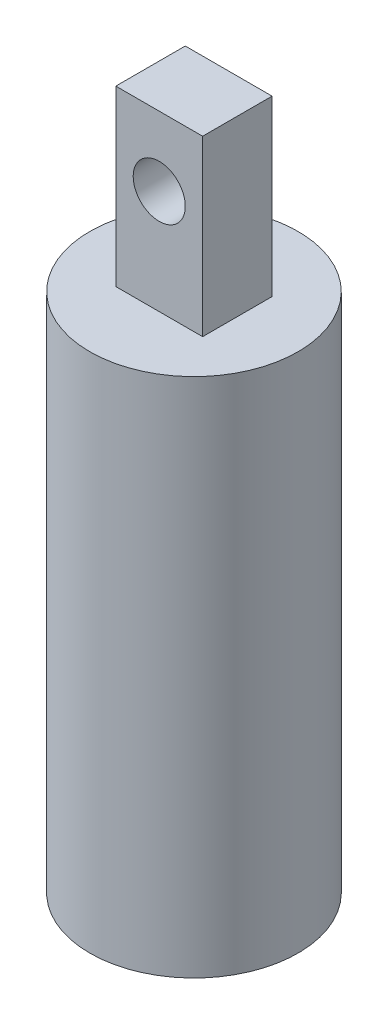
ISO-10303-21;
HEADER;
FILE_DESCRIPTION(('STEP AP214'),'2;1');
FILE_NAME('part.step','',(''),(''),'','','');
FILE_SCHEMA(('AUTOMOTIVE_DESIGN { 1 0 10303 214 1 1 1 1 }'));
ENDSEC;
DATA;
#1=APPLICATION_CONTEXT('core data for automotive mechanical design processes');
#2=APPLICATION_PROTOCOL_DEFINITION('international standard','automotive_design',2000,#1);
#3=PRODUCT_CONTEXT('',#1,'mechanical');
#4=PRODUCT('Part','Part','',(#3));
#5=PRODUCT_RELATED_PRODUCT_CATEGORY('part','',(#4));
#6=PRODUCT_DEFINITION_FORMATION('','',#4);
#7=PRODUCT_DEFINITION_CONTEXT('part definition',#1,'design');
#8=PRODUCT_DEFINITION('design','',#6,#7);
#9=PRODUCT_DEFINITION_SHAPE('','',#8);
#10=(LENGTH_UNIT() NAMED_UNIT(*) SI_UNIT(.MILLI.,.METRE.));
#11=(NAMED_UNIT(*) PLANE_ANGLE_UNIT() SI_UNIT($,.RADIAN.));
#12=(NAMED_UNIT(*) SI_UNIT($,.STERADIAN.) SOLID_ANGLE_UNIT());
#13=UNCERTAINTY_MEASURE_WITH_UNIT(LENGTH_MEASURE(1.E-05),#10,'distance_accuracy_value','');
#14=(GEOMETRIC_REPRESENTATION_CONTEXT(3) GLOBAL_UNCERTAINTY_ASSIGNED_CONTEXT((#13)) GLOBAL_UNIT_ASSIGNED_CONTEXT((#10,
#11,#12)) REPRESENTATION_CONTEXT('',''));
#15=CARTESIAN_POINT('',(0.,0.,0.));
#16=DIRECTION('',(0.,0.,1.));
#17=DIRECTION('',(1.,0.,0.));
#18=AXIS2_PLACEMENT_3D('',#15,#16,#17);
#19=CARTESIAN_POINT('',(0.,150.,0.));
#20=DIRECTION('',(0.,1.,0.));
#21=DIRECTION('',(0.,0.,1.));
#22=AXIS2_PLACEMENT_3D('',#19,#20,#21);
#23=PLANE('',#22);
#24=CARTESIAN_POINT('',(0.,150.,0.));
#25=DIRECTION('',(0.,1.,0.));
#26=DIRECTION('',(0.,0.,1.));
#27=AXIS2_PLACEMENT_3D('',#24,#25,#26);
#28=CIRCLE('',#27,30.);
#29=CARTESIAN_POINT('',(0.,150.,30.));
#30=VERTEX_POINT('',#29);
#31=EDGE_CURVE('E11',#30,#30,#28,.T.);
#32=ORIENTED_EDGE('',*,*,#31,.T.);
#33=EDGE_LOOP('',(#32));
#34=FACE_BOUND('',#33,.T.);
#35=DIRECTION('',(-1.,0.,0.));
#36=VECTOR('',#35,1.);
#37=CARTESIAN_POINT('',(-12.5,150.,-10.));
#38=LINE('',#37,#36);
#39=CARTESIAN_POINT('',(12.5,150.,-10.));
#40=VERTEX_POINT('',#39);
#41=CARTESIAN_POINT('',(-12.5,150.,-10.));
#42=VERTEX_POINT('',#41);
#43=EDGE_CURVE('E92',#40,#42,#38,.T.);
#44=ORIENTED_EDGE('',*,*,#43,.F.);
#45=DIRECTION('',(0.,0.,-1.));
#46=VECTOR('',#45,1.);
#47=CARTESIAN_POINT('',(12.5,150.,10.));
#48=LINE('',#47,#46);
#49=CARTESIAN_POINT('',(12.5,150.,10.));
#50=VERTEX_POINT('',#49);
#51=EDGE_CURVE('E103',#50,#40,#48,.T.);
#52=ORIENTED_EDGE('',*,*,#51,.F.);
#53=DIRECTION('',(1.,0.,0.));
#54=VECTOR('',#53,1.);
#55=CARTESIAN_POINT('',(-12.5,150.,10.));
#56=LINE('',#55,#54);
#57=CARTESIAN_POINT('',(-12.5,150.,10.));
#58=VERTEX_POINT('',#57);
#59=EDGE_CURVE('E73',#58,#50,#56,.T.);
#60=ORIENTED_EDGE('',*,*,#59,.F.);
#61=DIRECTION('',(0.,0.,1.));
#62=VECTOR('',#61,1.);
#63=CARTESIAN_POINT('',(-12.5,150.,10.));
#64=LINE('',#63,#62);
#65=EDGE_CURVE('E107',#42,#58,#64,.T.);
#66=ORIENTED_EDGE('',*,*,#65,.F.);
#67=EDGE_LOOP('',(#44,#52,#60,#66));
#68=FACE_BOUND('',#67,.T.);
#69=ADVANCED_FACE('F33',(#34,#68),#23,.T.);
#70=CARTESIAN_POINT('',(0.,150.,0.));
#71=DIRECTION('',(0.,-1.,0.));
#72=DIRECTION('',(0.,0.,-1.));
#73=AXIS2_PLACEMENT_3D('',#70,#71,#72);
#74=CYLINDRICAL_SURFACE('',#73,30.);
#75=CARTESIAN_POINT('',(-22.3606797749979,50.,-20.));
#76=CARTESIAN_POINT('',(-22.3606858935288,50.4882089561693,-19.9999964119226));
#77=CARTESIAN_POINT('',(-22.3767415723571,50.9764682917741,-19.9820866285813));
#78=CARTESIAN_POINT('',(-22.4401594085095,51.9483588125064,-19.9108373861768));
#79=CARTESIAN_POINT('',(-22.4875265581483,52.4319892471235,-19.8574922772833));
#80=CARTESIAN_POINT('',(-22.6113496939203,53.3911233213682,-19.7163799196857));
#81=CARTESIAN_POINT('',(-22.6878496694561,53.8666135294044,-19.6285606101057));
#82=CARTESIAN_POINT('',(-22.8665434498395,54.8053373732353,-19.4200919600602));
#83=CARTESIAN_POINT('',(-22.9687377513765,55.2685707719059,-19.2994419849513));
#84=CARTESIAN_POINT('',(-23.193728226989,56.175785139149,-19.0284426273943));
#85=CARTESIAN_POINT('',(-23.3163108203906,56.6199111296105,-18.8783985352891));
#86=CARTESIAN_POINT('',(-23.5787801839215,57.4921248793146,-18.5495380856482));
#87=CARTESIAN_POINT('',(-23.7186697909934,57.9202099941346,-18.3707170095788));
#88=CARTESIAN_POINT('',(-24.0118255935988,58.7591242148254,-17.9858478768931));
#89=CARTESIAN_POINT('',(-24.1650909347959,59.1699544203243,-17.7798015587787));
#90=CARTESIAN_POINT('',(-24.4813525241294,59.973620512308,-17.3417522052945));
#91=CARTESIAN_POINT('',(-24.644349445194,60.3664551510918,-17.1097473739498));
#92=CARTESIAN_POINT('',(-25.00257367896,61.1932268211757,-16.5827611461459));
#93=CARTESIAN_POINT('',(-25.1988679806497,61.6240409428177,-16.2835985891376));
#94=CARTESIAN_POINT('',(-25.5951544496233,62.4598274059487,-15.6533280846079));
#95=CARTESIAN_POINT('',(-25.7951468660549,62.8647979980787,-15.3222179783466));
#96=CARTESIAN_POINT('',(-26.194621993879,63.6481434866574,-14.6288076134715));
#97=CARTESIAN_POINT('',(-26.3941040691864,64.0264936382841,-14.2664790139786));
#98=CARTESIAN_POINT('',(-26.788258639696,64.7548145893199,-13.5118632099609));
#99=CARTESIAN_POINT('',(-26.9829308025026,65.1047834311923,-13.1195739425843));
#100=CARTESIAN_POINT('',(-27.3910931463656,65.8231340954399,-12.2471310095378));
#101=CARTESIAN_POINT('',(-27.6032288530363,66.1868495528045,-11.7624780965832));
#102=CARTESIAN_POINT('',(-28.0103500677694,66.8717372344808,-10.7570654072488));
#103=CARTESIAN_POINT('',(-28.2053335058183,67.1929043262227,-10.2363012863295));
#104=CARTESIAN_POINT('',(-28.5724511444835,67.7887598687195,-9.16171847148811));
#105=CARTESIAN_POINT('',(-28.7446044219641,68.0634871779264,-8.60792794262456));
#106=CARTESIAN_POINT('',(-29.0609568759301,68.5627727588207,-7.47053849984762));
#107=CARTESIAN_POINT('',(-29.205162039351,68.7873417767955,-6.88694600391359));
#108=CARTESIAN_POINT('',(-29.4464999554022,69.1602240381012,-5.76165832972235));
#109=CARTESIAN_POINT('',(-29.5470977395677,69.3142641521887,-5.22260227045828));
#110=CARTESIAN_POINT('',(-29.7196407127317,69.5772038937651,-4.1290667382128));
#111=CARTESIAN_POINT('',(-29.7915878345267,69.6861065662819,-3.57458830833751));
#112=CARTESIAN_POINT('',(-29.904587508942,69.8566974647913,-2.45588842993639));
#113=CARTESIAN_POINT('',(-29.9456724005222,69.9184351137685,-1.89167781543663));
#114=CARTESIAN_POINT('',(-29.9957633041667,69.9936647349202,-0.758659088769615));
#115=CARTESIAN_POINT('',(-30.0047738424215,70.007163514351,-0.1898516366429));
#116=CARTESIAN_POINT('',(-29.9915473981852,69.9873184370662,0.859806415927921));
#117=CARTESIAN_POINT('',(-29.9738593639155,69.9607940358833,1.34086232409545));
#118=CARTESIAN_POINT('',(-29.9156709892741,69.873310019839,2.29838953519059));
#119=CARTESIAN_POINT('',(-29.8751735935912,69.8123548499873,2.7748614218412));
#120=CARTESIAN_POINT('',(-29.7722764488344,69.6568520909165,3.71988287537239));
#121=CARTESIAN_POINT('',(-29.7098757494512,69.5623030441721,4.18843209759108));
#122=CARTESIAN_POINT('',(-29.5645234505635,69.3408382238798,5.11455664152082));
#123=CARTESIAN_POINT('',(-29.4815709628999,69.2139210515152,5.57213148802943));
#124=CARTESIAN_POINT('',(-29.2971987002846,68.9298040334638,6.47179810816158));
#125=CARTESIAN_POINT('',(-29.1958554904912,68.7727295883957,6.91394533614487));
#126=CARTESIAN_POINT('',(-28.9764235265008,68.4296096664266,7.78251525709052));
#127=CARTESIAN_POINT('',(-28.858335068488,68.2435647019401,8.20893822800988));
#128=CARTESIAN_POINT('',(-28.6075257726395,67.8441778455769,9.04431763466508));
#129=CARTESIAN_POINT('',(-28.4748045606182,67.6308352556287,9.45327362336783));
#130=CARTESIAN_POINT('',(-28.1969539999433,67.1784769804029,10.2523545489442));
#131=CARTESIAN_POINT('',(-28.0518231942476,66.9394582795807,10.6424772661187));
#132=CARTESIAN_POINT('',(-27.7317267401802,66.4042840153249,11.4527356062426));
#133=CARTESIAN_POINT('',(-27.5553463717531,66.1047473885238,11.8700812163928));
#134=CARTESIAN_POINT('',(-27.1930871485775,65.4767499308217,12.6780149842778));
#135=CARTESIAN_POINT('',(-27.007207587744,65.1482869484778,13.0686011478891));
#136=CARTESIAN_POINT('',(-26.6292105400492,64.4636253470291,13.8225619123957));
#137=CARTESIAN_POINT('',(-26.4370844912714,64.107387635318,14.185896693865));
#138=CARTESIAN_POINT('',(-26.0505351068054,63.3689696755022,14.883843396687));
#139=CARTESIAN_POINT('',(-25.8561116568934,62.9867881329827,15.2184538830105));
#140=CARTESIAN_POINT('',(-25.4387487342262,62.1362208652914,15.9077512722913));
#141=CARTESIAN_POINT('',(-25.2160728404677,61.6636681752519,16.2574779985587));
#142=CARTESIAN_POINT('',(-24.7793365815512,60.6867448691347,16.9156894234147));
#143=CARTESIAN_POINT('',(-24.5652781624035,60.1823671315698,17.2241648426867));
#144=CARTESIAN_POINT('',(-24.1532936665152,59.1437613448906,17.7972680129957));
#145=CARTESIAN_POINT('',(-23.9553464914574,58.6095739308747,18.0619535936899));
#146=CARTESIAN_POINT('',(-23.6764424287916,57.7871923826137,18.4241508744694));
#147=CARTESIAN_POINT('',(-23.586488758667,57.50958963684,18.539064186288));
#148=CARTESIAN_POINT('',(-23.4135888725702,56.9474950398416,18.7569503816948));
#149=CARTESIAN_POINT('',(-23.3306443694362,56.66300152644,18.8599203489511));
#150=CARTESIAN_POINT('',(-23.1390114191645,55.9640709186898,19.0949737019528));
#151=CARTESIAN_POINT('',(-23.0345499403737,55.5462614054596,19.2205883140043));
#152=CARTESIAN_POINT('',(-22.8454014192454,54.6992223190834,19.4450303060951));
#153=CARTESIAN_POINT('',(-22.7607089831938,54.2699958965713,19.5438649938583));
#154=CARTESIAN_POINT('',(-22.6140815263718,53.4027881110077,19.7133430846625));
#155=CARTESIAN_POINT('',(-22.5521140132966,52.9648201995233,19.78402675084));
#156=CARTESIAN_POINT('',(-22.4531500088269,52.0823363890967,19.8962732778957));
#157=CARTESIAN_POINT('',(-22.4161536183507,51.6378204636987,19.9378360210846));
#158=CARTESIAN_POINT('',(-22.3685666502113,50.7436020031146,19.9912114344644));
#159=CARTESIAN_POINT('',(-22.358093238586,50.2938852401166,20.0028921020166));
#160=CARTESIAN_POINT('',(-22.3643493087133,49.3948797020009,19.9958970388908));
#161=CARTESIAN_POINT('',(-22.381078855691,48.945590927912,19.9772212354264));
#162=CARTESIAN_POINT('',(-22.4410353821841,48.0507571397663,19.9098452800438));
#163=CARTESIAN_POINT('',(-22.4842812448844,47.6052150232529,19.8611237313693));
#164=CARTESIAN_POINT('',(-22.5954993646352,46.7214596956684,19.7344995148557));
#165=CARTESIAN_POINT('',(-22.6634720350192,46.2832466072377,19.6565963592159));
#166=CARTESIAN_POINT('',(-22.8176625120601,45.4382251784002,19.4773587360434));
#167=CARTESIAN_POINT('',(-22.9028156744356,45.0309336338161,19.3773687153742));
#168=CARTESIAN_POINT('',(-23.0905696500378,44.2270230951357,19.1532490632813));
#169=CARTESIAN_POINT('',(-23.193177203668,43.8304082928952,19.0291101035355));
#170=CARTESIAN_POINT('',(-23.4130553221982,43.0493436054479,18.7579126655137));
#171=CARTESIAN_POINT('',(-23.5303248016758,42.6648928223761,18.6108558836455));
#172=CARTESIAN_POINT('',(-23.7768089487605,41.9089960769436,18.2949037795793));
#173=CARTESIAN_POINT('',(-23.9060253493674,41.5375520121234,18.1260052876392));
#174=CARTESIAN_POINT('',(-24.2005356466709,40.7354679883655,17.731501269301));
#175=CARTESIAN_POINT('',(-24.3678787987211,40.3078327916935,17.5013086005028));
#176=CARTESIAN_POINT('',(-24.7117489529602,39.4731202414906,17.0123139239897));
#177=CARTESIAN_POINT('',(-24.8882768146534,39.0660448189915,16.7535092362064));
#178=CARTESIAN_POINT('',(-25.246838016415,38.2727606127612,16.2081390990385));
#179=CARTESIAN_POINT('',(-25.4288771074695,37.8865748863791,15.9215439116551));
#180=CARTESIAN_POINT('',(-25.7947122322757,37.1363134943561,15.3217576930429));
#181=CARTESIAN_POINT('',(-25.9785083830645,36.7722393136031,15.0085648790455));
#182=CARTESIAN_POINT('',(-26.3845748584298,35.9899770755621,14.2850209466699));
#183=CARTESIAN_POINT('',(-26.6064699077529,35.5773645182191,13.868399953091));
#184=CARTESIAN_POINT('',(-27.0422910024591,34.7883724206063,12.9981303927617));
#185=CARTESIAN_POINT('',(-27.2562155770218,34.4119995476734,12.5444750407322));
#186=CARTESIAN_POINT('',(-27.6705120036506,33.6984190377957,11.6020484650165));
#187=CARTESIAN_POINT('',(-27.8708931512095,33.3611844220412,11.1133018111967));
#188=CARTESIAN_POINT('',(-28.2529916116302,32.7287810619452,10.1024838029969));
#189=CARTESIAN_POINT('',(-28.4347139253593,32.4336010380343,9.58042143890719));
#190=CARTESIAN_POINT('',(-28.7418292040784,31.9411440611816,8.60898698059622));
#191=CARTESIAN_POINT('',(-28.871337394815,31.7359523812412,8.16491313347029));
#192=CARTESIAN_POINT('',(-29.1123779309699,31.3572563334412,7.25872966066569));
#193=CARTESIAN_POINT('',(-29.2239123246767,31.1837483546161,6.79662209756988));
#194=CARTESIAN_POINT('',(-29.4266077341683,30.8704547354404,5.85709265439536));
#195=CARTESIAN_POINT('',(-29.5177824027246,30.7306464917813,5.37968128385408));
#196=CARTESIAN_POINT('',(-29.6778186712604,30.4863780355943,4.41219358714593));
#197=CARTESIAN_POINT('',(-29.746679947541,30.3819183358641,3.92211707735813));
#198=CARTESIAN_POINT('',(-29.8607111976658,30.2094394737634,2.93054121015948));
#199=CARTESIAN_POINT('',(-29.9057729947659,30.1415866727295,2.42900032455905));
#200=CARTESIAN_POINT('',(-29.9706058238814,30.0440849964539,1.4205788168521));
#201=CARTESIAN_POINT('',(-29.990376815857,30.014436181696,0.913698186293067));
#202=CARTESIAN_POINT('',(-30.0041212399487,29.9938172077452,-0.101169392531006));
#203=CARTESIAN_POINT('',(-29.9980962089087,30.0028447443401,-0.60915627308706));
#204=CARTESIAN_POINT('',(-29.9604056252688,30.0594294541235,-1.62199988532036));
#205=CARTESIAN_POINT('',(-29.9287412395721,30.1069848738236,-2.12685675839743));
#206=CARTESIAN_POINT('',(-29.8437985658208,30.2350205740653,-3.092799752476));
#207=CARTESIAN_POINT('',(-29.7922629250282,30.312849853963,-3.55439520403418));
#208=CARTESIAN_POINT('',(-29.6689450523963,30.4999678776683,-4.46836902451353));
#209=CARTESIAN_POINT('',(-29.597163997457,30.6092547927981,-4.92074792756964));
#210=CARTESIAN_POINT('',(-29.4347944617128,30.8580043298309,-5.81367709229972));
#211=CARTESIAN_POINT('',(-29.344204797736,30.9974688501055,-6.25422660786598));
#212=CARTESIAN_POINT('',(-29.1459419809342,31.3050873348324,-7.12122590088718));
#213=CARTESIAN_POINT('',(-29.0382679265784,31.4732428133207,-7.5476749328341));
#214=CARTESIAN_POINT('',(-28.8010951909527,31.8471716831602,-8.40878779714672));
#215=CARTESIAN_POINT('',(-28.670694888708,32.0545573753971,-8.84250227551095));
#216=CARTESIAN_POINT('',(-28.3953682076704,32.4977973245283,-9.69029143409235));
#217=CARTESIAN_POINT('',(-28.2504414177065,32.7336523872842,-10.104365557902));
#218=CARTESIAN_POINT('',(-27.9485407408145,33.2321648601204,-10.9116855558948));
#219=CARTESIAN_POINT('',(-27.7915617237644,33.4948336995445,-11.3049224388242));
#220=CARTESIAN_POINT('',(-27.4682178656632,34.0452950703896,-12.0693531593151));
#221=CARTESIAN_POINT('',(-27.3018519735229,34.3330904173175,-12.4405445187535));
#222=CARTESIAN_POINT('',(-26.9357159197241,34.9795295007825,-13.2166207315211));
#223=CARTESIAN_POINT('',(-26.7348072575091,35.3421971516316,-13.6176230440809));
#224=CARTESIAN_POINT('',(-26.328297657734,36.0974614069631,-14.3878567191195));
#225=CARTESIAN_POINT('',(-26.1226961112019,36.4900619113291,-14.757083928306));
#226=CARTESIAN_POINT('',(-25.7111873767681,37.3039945349308,-15.4629181005339));
#227=CARTESIAN_POINT('',(-25.5052800753153,37.7253474084331,-15.7995010665117));
#228=CARTESIAN_POINT('',(-25.0981854077811,38.5953215433632,-16.4385088149113));
#229=CARTESIAN_POINT('',(-24.8969975860908,39.0439401574721,-16.7409369054171));
#230=CARTESIAN_POINT('',(-24.519622725546,39.932183263697,-17.288437587054));
#231=CARTESIAN_POINT('',(-24.3426994009277,40.3698820714834,-17.5361258011449));
#232=CARTESIAN_POINT('',(-24.0019984692107,41.2668444693518,-17.9996334824726));
#233=CARTESIAN_POINT('',(-23.838221257784,41.7261087078516,-18.2154519906584));
#234=CARTESIAN_POINT('',(-23.5290813254498,42.6642354776082,-18.6130511835398));
#235=CARTESIAN_POINT('',(-23.3836894022856,43.1430652893643,-18.7948860714089));
#236=CARTESIAN_POINT('',(-23.1163199010043,44.1191615403472,-19.1227764985234));
#237=CARTESIAN_POINT('',(-22.9943359489798,44.6164229165956,-19.268841780706));
#238=CARTESIAN_POINT('',(-22.802875861737,45.5146088087513,-19.4947592055363));
#239=CARTESIAN_POINT('',(-22.7277543004783,45.9124553216998,-19.5821115045836));
#240=CARTESIAN_POINT('',(-22.5970955375622,46.7158411532973,-19.7327455746581));
#241=CARTESIAN_POINT('',(-22.541555336465,47.1213792837199,-19.7960310323203));
#242=CARTESIAN_POINT('',(-22.4519236803042,47.9376537872121,-19.8976315087765));
#243=CARTESIAN_POINT('',(-22.4178171262643,48.3483862925499,-19.9359641063474));
#244=CARTESIAN_POINT('',(-22.3721912092578,49.1727335802446,-19.9871514199304));
#245=CARTESIAN_POINT('',(-22.3606745908688,49.5863487067014,-20.0000030401181));
#246=CARTESIAN_POINT('',(-22.3606797749979,50.,-20.));
#247=B_SPLINE_CURVE_WITH_KNOTS('',3,(#75,#76,#77,#78,#79,#80,#81,#82,#83,#84,#85,#86,#87,#88,
#89,#90,#91,#92,#93,#94,#95,#96,#97,#98,#99,#100,#101,#102,#103,#104,#105,#106,#107,#108,#109,
#110,#111,#112,#113,#114,#115,#116,#117,#118,#119,#120,#121,#122,#123,#124,#125,#126,#127,#128,
#129,#130,#131,#132,#133,#134,#135,#136,#137,#138,#139,#140,#141,#142,#143,#144,#145,#146,#147,
#148,#149,#150,#151,#152,#153,#154,#155,#156,#157,#158,#159,#160,#161,#162,#163,#164,#165,#166,
#167,#168,#169,#170,#171,#172,#173,#174,#175,#176,#177,#178,#179,#180,#181,#182,#183,#184,#185,
#186,#187,#188,#189,#190,#191,#192,#193,#194,#195,#196,#197,#198,#199,#200,#201,#202,#203,#204,
#205,#206,#207,#208,#209,#210,#211,#212,#213,#214,#215,#216,#217,#218,#219,#220,#221,#222,#223,
#224,#225,#226,#227,#228,#229,#230,#231,#232,#233,#234,#235,#236,#237,#238,#239,#240,#241,#242,
#243,#244,#245,#246),.UNSPECIFIED.,.T.,.F.,(4,2,2,2,2,2,2,2,2,2,2,2,2,2,2,2,2,2,2,2,2,2,2,2,2,2,
2,2,2,2,2,2,2,2,2,2,2,2,2,2,2,2,2,2,2,2,2,2,2,2,2,2,2,2,2,2,2,2,2,2,2,2,2,2,2,2,2,2,2,2,2,2,2,2,
2,2,2,2,2,2,2,2,2,2,2,4),(0.,1.46413383476119,2.92850116798433,4.3950884612604,5.86170410688106,
7.31382579475252,8.76618582863998,10.2184531650401,11.6708210407287,13.3493094048912,
15.0279112663608,16.7080533902126,18.3883112996803,20.3117642438544,22.2354490015051,
24.1575160629544,26.0791709305319,27.7853619359246,29.4914378208096,31.1957234922768,
32.8997686529781,34.3443503382155,35.7887455706705,37.2332034782288,38.6777238198782,
40.1163627603301,41.5549762578204,42.9936265517613,44.4324459938663,46.0602839475324,
47.6882430766068,49.3185364037738,50.9489111309836,52.8326361759336,54.7167842470655,
56.5984238649026,57.5389749114895,58.4797551409554,59.8242529017226,61.1683834046849,
62.5105844944298,63.8527910085193,65.2009164973756,66.5490452186684,67.8981351058559,
69.2472475454816,70.529851328563,71.8129515469024,73.095956833522,74.3791485235474,
75.9187799981372,77.4585558113538,78.999997879572,80.5415433482355,82.4201756779315,
84.2991529785491,86.1768272700558,88.0539969938139,89.5706110260008,91.0870521029024,
92.6024732144331,94.1179163090845,95.6401895843998,97.1624652697503,98.6846502640925,
100.206765984357,101.617993966733,103.029139928946,104.440374687427,105.851683940514,
107.344548709883,108.837455746597,110.331001811733,111.824715448892,113.553354854051,
115.282219865862,117.012346298594,118.742305015278,120.340261559248,121.93826618052,
123.53369984988,125.128698469926,126.370149556428,127.611410396842,128.85179584545,
130.092331986087),.UNSPECIFIED.);
#248=CARTESIAN_POINT('',(-22.3606797749979,50.,-20.));
#249=VERTEX_POINT('',#248);
#250=EDGE_CURVE('E115',#249,#249,#247,.T.);
#251=ORIENTED_EDGE('',*,*,#250,.T.);
#252=EDGE_LOOP('',(#251));
#253=FACE_BOUND('',#252,.T.);
#254=ORIENTED_EDGE('',*,*,#31,.F.);
#255=EDGE_LOOP('',(#254));
#256=FACE_BOUND('',#255,.T.);
#257=CARTESIAN_POINT('',(0.,0.,0.));
#258=DIRECTION('',(0.,1.,0.));
#259=DIRECTION('',(0.,0.,1.));
#260=AXIS2_PLACEMENT_3D('',#257,#258,#259);
#261=CIRCLE('',#260,30.);
#262=CARTESIAN_POINT('',(0.,0.,30.));
#263=VERTEX_POINT('',#262);
#264=EDGE_CURVE('E43',#263,#263,#261,.T.);
#265=ORIENTED_EDGE('',*,*,#264,.T.);
#266=EDGE_LOOP('',(#265));
#267=FACE_BOUND('',#266,.T.);
#268=ADVANCED_FACE('F35',(#253,#256,#267),#74,.T.);
#269=CARTESIAN_POINT('',(0.,0.,0.));
#270=DIRECTION('',(0.,1.,0.));
#271=DIRECTION('',(0.,0.,1.));
#272=AXIS2_PLACEMENT_3D('',#269,#270,#271);
#273=PLANE('',#272);
#274=ORIENTED_EDGE('',*,*,#264,.F.);
#275=EDGE_LOOP('',(#274));
#276=FACE_BOUND('',#275,.T.);
#277=ADVANCED_FACE('F128',(#276),#273,.F.);
#278=CARTESIAN_POINT('',(-100.,50.,0.));
#279=DIRECTION('',(1.,0.,0.));
#280=DIRECTION('',(0.,0.,-1.));
#281=AXIS2_PLACEMENT_3D('',#278,#279,#280);
#282=CYLINDRICAL_SURFACE('',#281,20.);
#283=CARTESIAN_POINT('',(0.,50.,0.));
#284=DIRECTION('',(1.,0.,0.));
#285=DIRECTION('',(0.,0.,-1.));
#286=AXIS2_PLACEMENT_3D('',#283,#284,#285);
#287=CIRCLE('',#286,20.);
#288=CARTESIAN_POINT('',(0.,50.,-20.));
#289=VERTEX_POINT('',#288);
#290=EDGE_CURVE('E113',#289,#289,#287,.T.);
#291=ORIENTED_EDGE('',*,*,#290,.T.);
#292=EDGE_LOOP('',(#291));
#293=FACE_BOUND('',#292,.T.);
#294=ORIENTED_EDGE('',*,*,#250,.F.);
#295=EDGE_LOOP('',(#294));
#296=FACE_BOUND('',#295,.T.);
#297=ADVANCED_FACE('F122',(#293,#296),#282,.F.);
#298=CARTESIAN_POINT('',(0.,0.,0.));
#299=DIRECTION('',(1.,0.,0.));
#300=DIRECTION('',(0.,0.,-1.));
#301=AXIS2_PLACEMENT_3D('',#298,#299,#300);
#302=PLANE('',#301);
#303=ORIENTED_EDGE('',*,*,#290,.F.);
#304=EDGE_LOOP('',(#303));
#305=FACE_BOUND('',#304,.T.);
#306=ADVANCED_FACE('F127',(#305),#302,.F.);
#307=CARTESIAN_POINT('',(12.5,200.,10.));
#308=DIRECTION('',(-1.,0.,0.));
#309=DIRECTION('',(0.,0.,1.));
#310=AXIS2_PLACEMENT_3D('',#307,#308,#309);
#311=PLANE('',#310);
#312=ORIENTED_EDGE('',*,*,#51,.T.);
#313=DIRECTION('',(0.,-1.,0.));
#314=VECTOR('',#313,1.);
#315=CARTESIAN_POINT('',(12.5,200.,-10.));
#316=LINE('',#315,#314);
#317=CARTESIAN_POINT('',(12.5,200.,-10.));
#318=VERTEX_POINT('',#317);
#319=EDGE_CURVE('E95',#318,#40,#316,.T.);
#320=ORIENTED_EDGE('',*,*,#319,.F.);
#321=DIRECTION('',(0.,0.,-1.));
#322=VECTOR('',#321,1.);
#323=CARTESIAN_POINT('',(12.5,200.,10.));
#324=LINE('',#323,#322);
#325=CARTESIAN_POINT('',(12.5,200.,10.));
#326=VERTEX_POINT('',#325);
#327=EDGE_CURVE('E85',#326,#318,#324,.T.);
#328=ORIENTED_EDGE('',*,*,#327,.F.);
#329=DIRECTION('',(0.,-1.,0.));
#330=VECTOR('',#329,1.);
#331=CARTESIAN_POINT('',(12.5,200.,10.));
#332=LINE('',#331,#330);
#333=EDGE_CURVE('E99',#326,#50,#332,.T.);
#334=ORIENTED_EDGE('',*,*,#333,.T.);
#335=EDGE_LOOP('',(#312,#320,#328,#334));
#336=FACE_BOUND('',#335,.T.);
#337=ADVANCED_FACE('F149',(#336),#311,.F.);
#338=CARTESIAN_POINT('',(-12.5,200.,-10.));
#339=DIRECTION('',(0.,0.,1.));
#340=DIRECTION('',(1.,0.,0.));
#341=AXIS2_PLACEMENT_3D('',#338,#339,#340);
#342=PLANE('',#341);
#343=CARTESIAN_POINT('',(0.,180.,-10.));
#344=DIRECTION('',(0.,0.,-1.));
#345=DIRECTION('',(-1.,0.,0.));
#346=AXIS2_PLACEMENT_3D('',#343,#344,#345);
#347=CIRCLE('',#346,7.5);
#348=CARTESIAN_POINT('',(-7.5,180.,-10.));
#349=VERTEX_POINT('',#348);
#350=EDGE_CURVE('E233',#349,#349,#347,.T.);
#351=ORIENTED_EDGE('',*,*,#350,.F.);
#352=EDGE_LOOP('',(#351));
#353=FACE_BOUND('',#352,.T.);
#354=ORIENTED_EDGE('',*,*,#43,.T.);
#355=DIRECTION('',(0.,-1.,0.));
#356=VECTOR('',#355,1.);
#357=CARTESIAN_POINT('',(-12.5,200.,-10.));
#358=LINE('',#357,#356);
#359=CARTESIAN_POINT('',(-12.5,200.,-10.));
#360=VERTEX_POINT('',#359);
#361=EDGE_CURVE('E89',#360,#42,#358,.T.);
#362=ORIENTED_EDGE('',*,*,#361,.F.);
#363=DIRECTION('',(-1.,0.,0.));
#364=VECTOR('',#363,1.);
#365=CARTESIAN_POINT('',(-12.5,200.,-10.));
#366=LINE('',#365,#364);
#367=EDGE_CURVE('E80',#318,#360,#366,.T.);
#368=ORIENTED_EDGE('',*,*,#367,.F.);
#369=ORIENTED_EDGE('',*,*,#319,.T.);
#370=EDGE_LOOP('',(#354,#362,#368,#369));
#371=FACE_BOUND('',#370,.T.);
#372=ADVANCED_FACE('F90',(#353,#371),#342,.F.);
#373=CARTESIAN_POINT('',(-12.5,200.,10.));
#374=DIRECTION('',(1.,0.,0.));
#375=DIRECTION('',(0.,0.,-1.));
#376=AXIS2_PLACEMENT_3D('',#373,#374,#375);
#377=PLANE('',#376);
#378=ORIENTED_EDGE('',*,*,#65,.T.);
#379=DIRECTION('',(0.,-1.,0.));
#380=VECTOR('',#379,1.);
#381=CARTESIAN_POINT('',(-12.5,200.,10.));
#382=LINE('',#381,#380);
#383=CARTESIAN_POINT('',(-12.5,200.,10.));
#384=VERTEX_POINT('',#383);
#385=EDGE_CURVE('E51',#384,#58,#382,.T.);
#386=ORIENTED_EDGE('',*,*,#385,.F.);
#387=DIRECTION('',(0.,0.,1.));
#388=VECTOR('',#387,1.);
#389=CARTESIAN_POINT('',(-12.5,200.,10.));
#390=LINE('',#389,#388);
#391=EDGE_CURVE('E83',#360,#384,#390,.T.);
#392=ORIENTED_EDGE('',*,*,#391,.F.);
#393=ORIENTED_EDGE('',*,*,#361,.T.);
#394=EDGE_LOOP('',(#378,#386,#392,#393));
#395=FACE_BOUND('',#394,.T.);
#396=ADVANCED_FACE('F97',(#395),#377,.F.);
#397=CARTESIAN_POINT('',(-12.5,200.,10.));
#398=DIRECTION('',(0.,0.,-1.));
#399=DIRECTION('',(-1.,0.,0.));
#400=AXIS2_PLACEMENT_3D('',#397,#398,#399);
#401=PLANE('',#400);
#402=CARTESIAN_POINT('',(0.,180.,10.));
#403=DIRECTION('',(0.,0.,-1.));
#404=DIRECTION('',(-1.,0.,0.));
#405=AXIS2_PLACEMENT_3D('',#402,#403,#404);
#406=CIRCLE('',#405,7.5);
#407=CARTESIAN_POINT('',(-7.5,180.,10.));
#408=VERTEX_POINT('',#407);
#409=EDGE_CURVE('E38',#408,#408,#406,.T.);
#410=ORIENTED_EDGE('',*,*,#409,.T.);
#411=EDGE_LOOP('',(#410));
#412=FACE_BOUND('',#411,.T.);
#413=ORIENTED_EDGE('',*,*,#59,.T.);
#414=ORIENTED_EDGE('',*,*,#333,.F.);
#415=DIRECTION('',(1.,0.,0.));
#416=VECTOR('',#415,1.);
#417=CARTESIAN_POINT('',(-12.5,200.,10.));
#418=LINE('',#417,#416);
#419=EDGE_CURVE('E59',#384,#326,#418,.T.);
#420=ORIENTED_EDGE('',*,*,#419,.F.);
#421=ORIENTED_EDGE('',*,*,#385,.T.);
#422=EDGE_LOOP('',(#413,#414,#420,#421));
#423=FACE_BOUND('',#422,.T.);
#424=ADVANCED_FACE('F150',(#412,#423),#401,.F.);
#425=CARTESIAN_POINT('',(0.,200.,0.));
#426=DIRECTION('',(0.,-1.,0.));
#427=DIRECTION('',(0.,0.,-1.));
#428=AXIS2_PLACEMENT_3D('',#425,#426,#427);
#429=PLANE('',#428);
#430=ORIENTED_EDGE('',*,*,#327,.T.);
#431=ORIENTED_EDGE('',*,*,#367,.T.);
#432=ORIENTED_EDGE('',*,*,#391,.T.);
#433=ORIENTED_EDGE('',*,*,#419,.T.);
#434=EDGE_LOOP('',(#430,#431,#432,#433));
#435=FACE_BOUND('',#434,.T.);
#436=ADVANCED_FACE('F81',(#435),#429,.F.);
#437=CARTESIAN_POINT('',(0.,180.,30.));
#438=DIRECTION('',(0.,0.,-1.));
#439=DIRECTION('',(-1.,0.,0.));
#440=AXIS2_PLACEMENT_3D('',#437,#438,#439);
#441=CYLINDRICAL_SURFACE('',#440,7.5);
#442=ORIENTED_EDGE('',*,*,#350,.T.);
#443=EDGE_LOOP('',(#442));
#444=FACE_BOUND('',#443,.T.);
#445=ORIENTED_EDGE('',*,*,#409,.F.);
#446=EDGE_LOOP('',(#445));
#447=FACE_BOUND('',#446,.T.);
#448=ADVANCED_FACE('F158',(#444,#447),#441,.F.);
#449=CLOSED_SHELL('',(#69,#268,#277,#297,#306,#337,#372,#396,#424,#436,#448));
#450=MANIFOLD_SOLID_BREP('B2',#449);
#451=ADVANCED_BREP_SHAPE_REPRESENTATION('',(#18,#450),#14);
#452=SHAPE_DEFINITION_REPRESENTATION(#9,#451);
ENDSEC;
END-ISO-10303-21;
